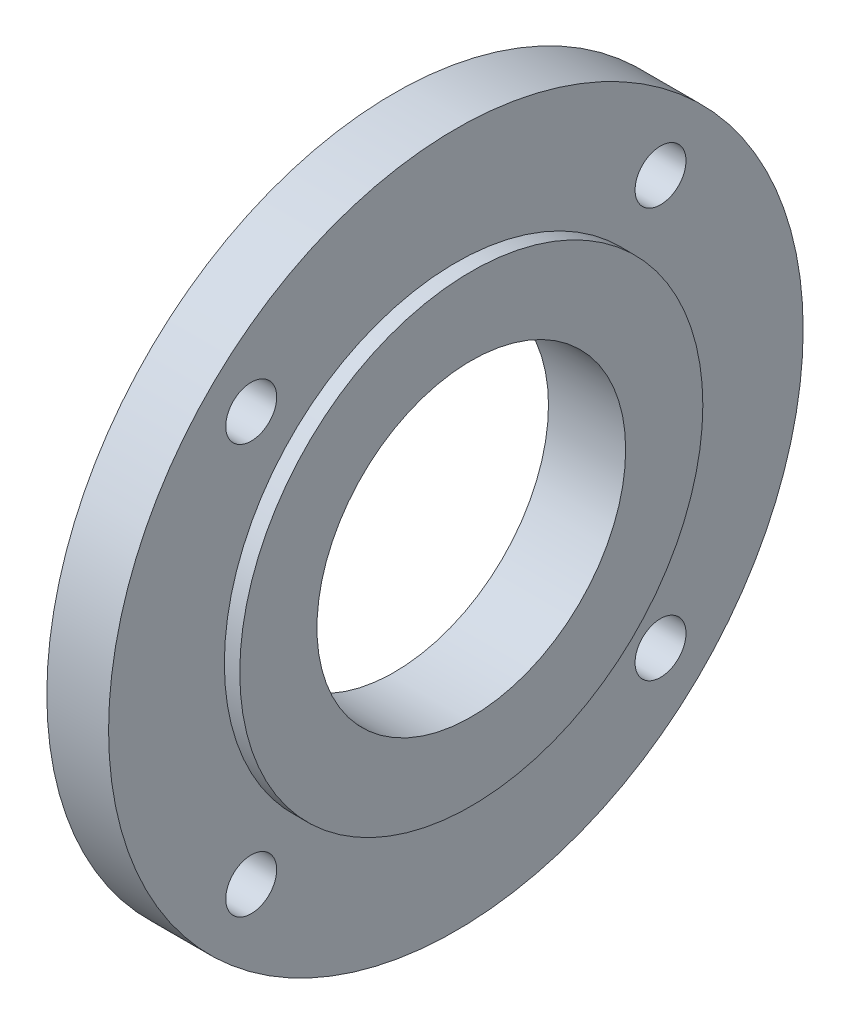
ISO-10303-21;
HEADER;
FILE_DESCRIPTION(('STEP AP214'),'2;1');
FILE_NAME('part.step','',(''),(''),'','','');
FILE_SCHEMA(('AUTOMOTIVE_DESIGN { 1 0 10303 214 1 1 1 1 }'));
ENDSEC;
DATA;
#1=APPLICATION_CONTEXT('core data for automotive mechanical design processes');
#2=APPLICATION_PROTOCOL_DEFINITION('international standard','automotive_design',2000,#1);
#3=PRODUCT_CONTEXT('',#1,'mechanical');
#4=PRODUCT('Part','Part','',(#3));
#5=PRODUCT_RELATED_PRODUCT_CATEGORY('part','',(#4));
#6=PRODUCT_DEFINITION_FORMATION('','',#4);
#7=PRODUCT_DEFINITION_CONTEXT('part definition',#1,'design');
#8=PRODUCT_DEFINITION('design','',#6,#7);
#9=PRODUCT_DEFINITION_SHAPE('','',#8);
#10=(LENGTH_UNIT() NAMED_UNIT(*) SI_UNIT(.MILLI.,.METRE.));
#11=(NAMED_UNIT(*) PLANE_ANGLE_UNIT() SI_UNIT($,.RADIAN.));
#12=(NAMED_UNIT(*) SI_UNIT($,.STERADIAN.) SOLID_ANGLE_UNIT());
#13=UNCERTAINTY_MEASURE_WITH_UNIT(LENGTH_MEASURE(1.E-05),#10,'distance_accuracy_value','');
#14=(GEOMETRIC_REPRESENTATION_CONTEXT(3) GLOBAL_UNCERTAINTY_ASSIGNED_CONTEXT((#13)) GLOBAL_UNIT_ASSIGNED_CONTEXT((#10,
#11,#12)) REPRESENTATION_CONTEXT('',''));
#15=CARTESIAN_POINT('',(0.,0.,0.));
#16=DIRECTION('',(0.,0.,1.));
#17=DIRECTION('',(1.,0.,0.));
#18=AXIS2_PLACEMENT_3D('',#15,#16,#17);
#19=CARTESIAN_POINT('',(5.,0.,0.));
#20=DIRECTION('',(-1.,0.,0.));
#21=DIRECTION('',(0.,0.,1.));
#22=AXIS2_PLACEMENT_3D('',#19,#20,#21);
#23=CYLINDRICAL_SURFACE('',#22,15.);
#24=CARTESIAN_POINT('',(5.,0.,0.));
#25=DIRECTION('',(1.,0.,0.));
#26=DIRECTION('',(0.,0.,-1.));
#27=AXIS2_PLACEMENT_3D('',#24,#25,#26);
#28=CIRCLE('',#27,15.);
#29=CARTESIAN_POINT('',(5.,0.,-15.));
#30=VERTEX_POINT('',#29);
#31=EDGE_CURVE('E58',#30,#30,#28,.T.);
#32=ORIENTED_EDGE('',*,*,#31,.F.);
#33=EDGE_LOOP('',(#32));
#34=FACE_BOUND('',#33,.T.);
#35=CARTESIAN_POINT('',(4.,0.,0.));
#36=DIRECTION('',(-1.,0.,0.));
#37=DIRECTION('',(0.,0.,1.));
#38=AXIS2_PLACEMENT_3D('',#35,#36,#37);
#39=CIRCLE('',#38,15.);
#40=CARTESIAN_POINT('',(4.,0.,15.));
#41=VERTEX_POINT('',#40);
#42=EDGE_CURVE('E10',#41,#41,#39,.T.);
#43=ORIENTED_EDGE('',*,*,#42,.F.);
#44=EDGE_LOOP('',(#43));
#45=FACE_BOUND('',#44,.T.);
#46=ADVANCED_FACE('F51',(#34,#45),#23,.T.);
#47=CARTESIAN_POINT('',(5.,0.,0.));
#48=DIRECTION('',(1.,0.,0.));
#49=DIRECTION('',(0.,0.,-1.));
#50=AXIS2_PLACEMENT_3D('',#47,#48,#49);
#51=PLANE('',#50);
#52=CARTESIAN_POINT('',(5.,0.,0.));
#53=DIRECTION('',(1.,0.,0.));
#54=DIRECTION('',(0.,0.,-1.));
#55=AXIS2_PLACEMENT_3D('',#52,#53,#54);
#56=CIRCLE('',#55,10.);
#57=CARTESIAN_POINT('',(5.,0.,-10.));
#58=VERTEX_POINT('',#57);
#59=EDGE_CURVE('E75',#58,#58,#56,.T.);
#60=ORIENTED_EDGE('',*,*,#59,.F.);
#61=EDGE_LOOP('',(#60));
#62=FACE_BOUND('',#61,.T.);
#63=ORIENTED_EDGE('',*,*,#31,.T.);
#64=EDGE_LOOP('',(#63));
#65=FACE_BOUND('',#64,.T.);
#66=ADVANCED_FACE('F133',(#62,#65),#51,.T.);
#67=CARTESIAN_POINT('',(4.,0.,0.));
#68=DIRECTION('',(-1.,0.,0.));
#69=DIRECTION('',(0.,0.,1.));
#70=AXIS2_PLACEMENT_3D('',#67,#68,#69);
#71=CYLINDRICAL_SURFACE('',#70,22.5);
#72=CARTESIAN_POINT('',(4.,0.,0.));
#73=DIRECTION('',(-1.,0.,0.));
#74=DIRECTION('',(0.,0.,1.));
#75=AXIS2_PLACEMENT_3D('',#72,#73,#74);
#76=CIRCLE('',#75,22.5);
#77=CARTESIAN_POINT('',(4.,0.,22.5));
#78=VERTEX_POINT('',#77);
#79=EDGE_CURVE('E63',#78,#78,#76,.T.);
#80=ORIENTED_EDGE('',*,*,#79,.T.);
#81=EDGE_LOOP('',(#80));
#82=FACE_BOUND('',#81,.T.);
#83=CARTESIAN_POINT('',(0.,0.,0.));
#84=DIRECTION('',(-1.,0.,0.));
#85=DIRECTION('',(0.,0.,1.));
#86=AXIS2_PLACEMENT_3D('',#83,#84,#85);
#87=CIRCLE('',#86,22.5);
#88=CARTESIAN_POINT('',(0.,0.,22.5));
#89=VERTEX_POINT('',#88);
#90=EDGE_CURVE('E68',#89,#89,#87,.T.);
#91=ORIENTED_EDGE('',*,*,#90,.F.);
#92=EDGE_LOOP('',(#91));
#93=FACE_BOUND('',#92,.T.);
#94=ADVANCED_FACE('F121',(#82,#93),#71,.T.);
#95=CARTESIAN_POINT('',(4.,0.,0.));
#96=DIRECTION('',(-1.,0.,0.));
#97=DIRECTION('',(0.,0.,1.));
#98=AXIS2_PLACEMENT_3D('',#95,#96,#97);
#99=PLANE('',#98);
#100=CARTESIAN_POINT('',(4.,13.2582521472477,13.2582521472478));
#101=DIRECTION('',(1.,0.,0.));
#102=DIRECTION('',(0.,0.,-1.));
#103=AXIS2_PLACEMENT_3D('',#100,#101,#102);
#104=CIRCLE('',#103,1.64999999999999);
#105=CARTESIAN_POINT('',(4.,13.2582521472477,11.6082521472478));
#106=VERTEX_POINT('',#105);
#107=EDGE_CURVE('E110',#106,#106,#104,.T.);
#108=ORIENTED_EDGE('',*,*,#107,.F.);
#109=EDGE_LOOP('',(#108));
#110=FACE_BOUND('',#109,.T.);
#111=CARTESIAN_POINT('',(4.,13.2582521472477,-13.2582521472479));
#112=DIRECTION('',(1.,0.,0.));
#113=DIRECTION('',(0.,0.,-1.));
#114=AXIS2_PLACEMENT_3D('',#111,#112,#113);
#115=CIRCLE('',#114,1.64999999999999);
#116=CARTESIAN_POINT('',(4.,13.2582521472477,-14.9082521472479));
#117=VERTEX_POINT('',#116);
#118=EDGE_CURVE('E102',#117,#117,#115,.T.);
#119=ORIENTED_EDGE('',*,*,#118,.F.);
#120=EDGE_LOOP('',(#119));
#121=FACE_BOUND('',#120,.T.);
#122=CARTESIAN_POINT('',(4.,-13.258252147248,-13.2582521472479));
#123=DIRECTION('',(1.,0.,0.));
#124=DIRECTION('',(0.,0.,-1.));
#125=AXIS2_PLACEMENT_3D('',#122,#123,#124);
#126=CIRCLE('',#125,1.64999999999999);
#127=CARTESIAN_POINT('',(4.,-13.258252147248,-14.9082521472479));
#128=VERTEX_POINT('',#127);
#129=EDGE_CURVE('E94',#128,#128,#126,.T.);
#130=ORIENTED_EDGE('',*,*,#129,.F.);
#131=EDGE_LOOP('',(#130));
#132=FACE_BOUND('',#131,.T.);
#133=CARTESIAN_POINT('',(4.,-13.258252147248,13.2582521472478));
#134=DIRECTION('',(1.,0.,0.));
#135=DIRECTION('',(0.,0.,-1.));
#136=AXIS2_PLACEMENT_3D('',#133,#134,#135);
#137=CIRCLE('',#136,1.64999999999999);
#138=CARTESIAN_POINT('',(4.,-13.258252147248,11.6082521472478));
#139=VERTEX_POINT('',#138);
#140=EDGE_CURVE('E86',#139,#139,#137,.T.);
#141=ORIENTED_EDGE('',*,*,#140,.F.);
#142=EDGE_LOOP('',(#141));
#143=FACE_BOUND('',#142,.T.);
#144=ORIENTED_EDGE('',*,*,#42,.T.);
#145=EDGE_LOOP('',(#144));
#146=FACE_BOUND('',#145,.T.);
#147=ORIENTED_EDGE('',*,*,#79,.F.);
#148=EDGE_LOOP('',(#147));
#149=FACE_BOUND('',#148,.T.);
#150=ADVANCED_FACE('F117',(#110,#121,#132,#143,#146,#149),#99,.F.);
#151=CARTESIAN_POINT('',(0.,0.,0.));
#152=DIRECTION('',(1.,0.,0.));
#153=DIRECTION('',(0.,0.,-1.));
#154=AXIS2_PLACEMENT_3D('',#151,#152,#153);
#155=PLANE('',#154);
#156=CARTESIAN_POINT('',(0.,13.2582521472477,13.2582521472478));
#157=DIRECTION('',(1.,0.,0.));
#158=DIRECTION('',(0.,0.,-1.));
#159=AXIS2_PLACEMENT_3D('',#156,#157,#158);
#160=CIRCLE('',#159,1.65);
#161=CARTESIAN_POINT('',(0.,13.2582521472477,11.6082521472478));
#162=VERTEX_POINT('',#161);
#163=EDGE_CURVE('E106',#162,#162,#160,.T.);
#164=ORIENTED_EDGE('',*,*,#163,.T.);
#165=EDGE_LOOP('',(#164));
#166=FACE_BOUND('',#165,.T.);
#167=CARTESIAN_POINT('',(0.,13.2582521472477,-13.2582521472479));
#168=DIRECTION('',(1.,0.,0.));
#169=DIRECTION('',(0.,0.,-1.));
#170=AXIS2_PLACEMENT_3D('',#167,#168,#169);
#171=CIRCLE('',#170,1.65);
#172=CARTESIAN_POINT('',(0.,13.2582521472477,-14.9082521472479));
#173=VERTEX_POINT('',#172);
#174=EDGE_CURVE('E98',#173,#173,#171,.T.);
#175=ORIENTED_EDGE('',*,*,#174,.T.);
#176=EDGE_LOOP('',(#175));
#177=FACE_BOUND('',#176,.T.);
#178=CARTESIAN_POINT('',(0.,-13.258252147248,-13.2582521472479));
#179=DIRECTION('',(1.,0.,0.));
#180=DIRECTION('',(0.,0.,-1.));
#181=AXIS2_PLACEMENT_3D('',#178,#179,#180);
#182=CIRCLE('',#181,1.65);
#183=CARTESIAN_POINT('',(0.,-13.258252147248,-14.9082521472479));
#184=VERTEX_POINT('',#183);
#185=EDGE_CURVE('E90',#184,#184,#182,.T.);
#186=ORIENTED_EDGE('',*,*,#185,.T.);
#187=EDGE_LOOP('',(#186));
#188=FACE_BOUND('',#187,.T.);
#189=CARTESIAN_POINT('',(0.,-13.258252147248,13.2582521472478));
#190=DIRECTION('',(1.,0.,0.));
#191=DIRECTION('',(0.,0.,-1.));
#192=AXIS2_PLACEMENT_3D('',#189,#190,#191);
#193=CIRCLE('',#192,1.65);
#194=CARTESIAN_POINT('',(0.,-13.258252147248,11.6082521472478));
#195=VERTEX_POINT('',#194);
#196=EDGE_CURVE('E79',#195,#195,#193,.T.);
#197=ORIENTED_EDGE('',*,*,#196,.T.);
#198=EDGE_LOOP('',(#197));
#199=FACE_BOUND('',#198,.T.);
#200=CARTESIAN_POINT('',(0.,0.,0.));
#201=DIRECTION('',(1.,0.,0.));
#202=DIRECTION('',(0.,0.,-1.));
#203=AXIS2_PLACEMENT_3D('',#200,#201,#202);
#204=CIRCLE('',#203,10.);
#205=CARTESIAN_POINT('',(0.,0.,-10.));
#206=VERTEX_POINT('',#205);
#207=EDGE_CURVE('E73',#206,#206,#204,.T.);
#208=ORIENTED_EDGE('',*,*,#207,.T.);
#209=EDGE_LOOP('',(#208));
#210=FACE_BOUND('',#209,.T.);
#211=ORIENTED_EDGE('',*,*,#90,.T.);
#212=EDGE_LOOP('',(#211));
#213=FACE_BOUND('',#212,.T.);
#214=ADVANCED_FACE('F120',(#166,#177,#188,#199,#210,#213),#155,.F.);
#215=CARTESIAN_POINT('',(0.,0.,0.));
#216=DIRECTION('',(1.,0.,0.));
#217=DIRECTION('',(0.,0.,-1.));
#218=AXIS2_PLACEMENT_3D('',#215,#216,#217);
#219=CYLINDRICAL_SURFACE('',#218,10.);
#220=ORIENTED_EDGE('',*,*,#207,.F.);
#221=EDGE_LOOP('',(#220));
#222=FACE_BOUND('',#221,.T.);
#223=ORIENTED_EDGE('',*,*,#59,.T.);
#224=EDGE_LOOP('',(#223));
#225=FACE_BOUND('',#224,.T.);
#226=ADVANCED_FACE('F138',(#222,#225),#219,.F.);
#227=CARTESIAN_POINT('',(4.,-13.258252147248,13.2582521472478));
#228=DIRECTION('',(1.,0.,0.));
#229=DIRECTION('',(0.,0.,-1.));
#230=AXIS2_PLACEMENT_3D('',#227,#228,#229);
#231=CYLINDRICAL_SURFACE('',#230,1.64999999999999);
#232=ORIENTED_EDGE('',*,*,#196,.F.);
#233=EDGE_LOOP('',(#232));
#234=FACE_BOUND('',#233,.T.);
#235=ORIENTED_EDGE('',*,*,#140,.T.);
#236=EDGE_LOOP('',(#235));
#237=FACE_BOUND('',#236,.T.);
#238=ADVANCED_FACE('F145',(#234,#237),#231,.F.);
#239=CARTESIAN_POINT('',(4.,-13.258252147248,-13.2582521472479));
#240=DIRECTION('',(1.,0.,0.));
#241=DIRECTION('',(0.,0.,-1.));
#242=AXIS2_PLACEMENT_3D('',#239,#240,#241);
#243=CYLINDRICAL_SURFACE('',#242,1.64999999999999);
#244=ORIENTED_EDGE('',*,*,#185,.F.);
#245=EDGE_LOOP('',(#244));
#246=FACE_BOUND('',#245,.T.);
#247=ORIENTED_EDGE('',*,*,#129,.T.);
#248=EDGE_LOOP('',(#247));
#249=FACE_BOUND('',#248,.T.);
#250=ADVANCED_FACE('F163',(#246,#249),#243,.F.);
#251=CARTESIAN_POINT('',(4.,13.2582521472477,-13.2582521472479));
#252=DIRECTION('',(1.,0.,0.));
#253=DIRECTION('',(0.,0.,-1.));
#254=AXIS2_PLACEMENT_3D('',#251,#252,#253);
#255=CYLINDRICAL_SURFACE('',#254,1.64999999999999);
#256=ORIENTED_EDGE('',*,*,#174,.F.);
#257=EDGE_LOOP('',(#256));
#258=FACE_BOUND('',#257,.T.);
#259=ORIENTED_EDGE('',*,*,#118,.T.);
#260=EDGE_LOOP('',(#259));
#261=FACE_BOUND('',#260,.T.);
#262=ADVANCED_FACE('F167',(#258,#261),#255,.F.);
#263=CARTESIAN_POINT('',(4.,13.2582521472477,13.2582521472478));
#264=DIRECTION('',(1.,0.,0.));
#265=DIRECTION('',(0.,0.,-1.));
#266=AXIS2_PLACEMENT_3D('',#263,#264,#265);
#267=CYLINDRICAL_SURFACE('',#266,1.64999999999999);
#268=ORIENTED_EDGE('',*,*,#163,.F.);
#269=EDGE_LOOP('',(#268));
#270=FACE_BOUND('',#269,.T.);
#271=ORIENTED_EDGE('',*,*,#107,.T.);
#272=EDGE_LOOP('',(#271));
#273=FACE_BOUND('',#272,.T.);
#274=ADVANCED_FACE('F115',(#270,#273),#267,.F.);
#275=CLOSED_SHELL('',(#46,#66,#94,#150,#214,#226,#238,#250,#262,#274));
#276=MANIFOLD_SOLID_BREP('B2',#275);
#277=ADVANCED_BREP_SHAPE_REPRESENTATION('',(#18,#276),#14);
#278=SHAPE_DEFINITION_REPRESENTATION(#9,#277);
ENDSEC;
END-ISO-10303-21;
